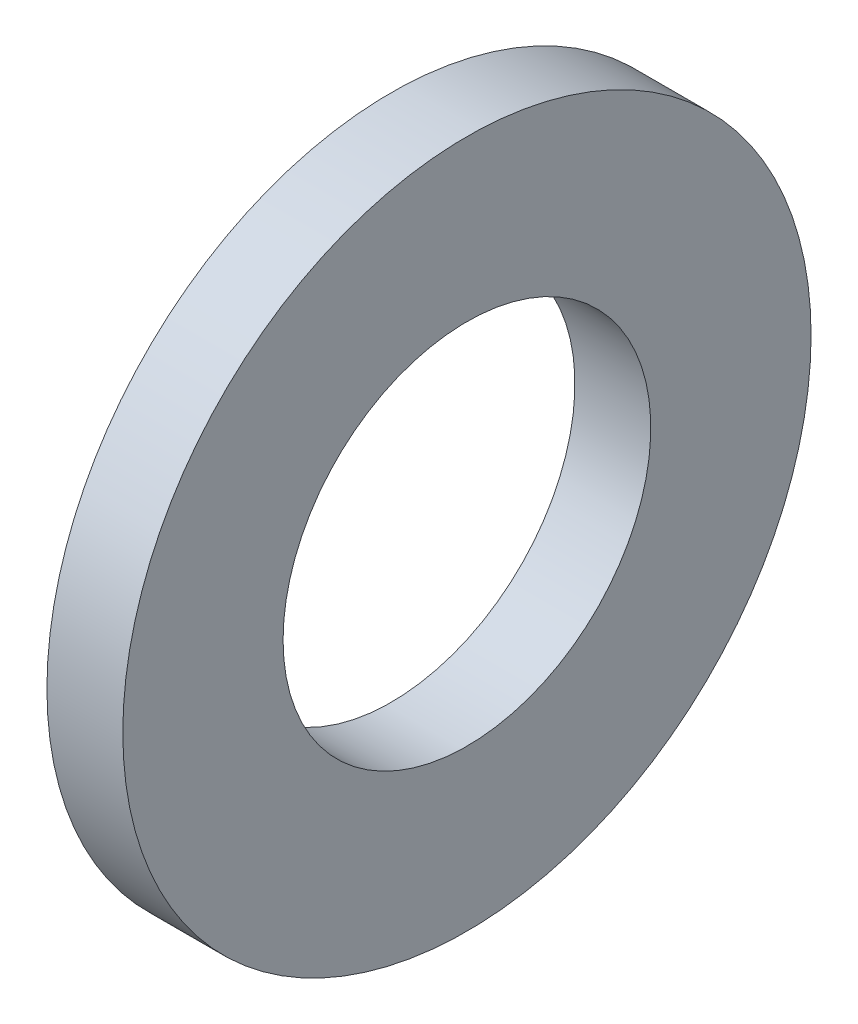
ISO-10303-21;
HEADER;
FILE_DESCRIPTION(('STEP AP214'),'2;1');
FILE_NAME('part.step','',(''),(''),'','','');
FILE_SCHEMA(('AUTOMOTIVE_DESIGN { 1 0 10303 214 1 1 1 1 }'));
ENDSEC;
DATA;
#1=APPLICATION_CONTEXT('core data for automotive mechanical design processes');
#2=APPLICATION_PROTOCOL_DEFINITION('international standard','automotive_design',2000,#1);
#3=PRODUCT_CONTEXT('',#1,'mechanical');
#4=PRODUCT('Part','Part','',(#3));
#5=PRODUCT_RELATED_PRODUCT_CATEGORY('part','',(#4));
#6=PRODUCT_DEFINITION_FORMATION('','',#4);
#7=PRODUCT_DEFINITION_CONTEXT('part definition',#1,'design');
#8=PRODUCT_DEFINITION('design','',#6,#7);
#9=PRODUCT_DEFINITION_SHAPE('','',#8);
#10=(LENGTH_UNIT() NAMED_UNIT(*) SI_UNIT(.MILLI.,.METRE.));
#11=(NAMED_UNIT(*) PLANE_ANGLE_UNIT() SI_UNIT($,.RADIAN.));
#12=(NAMED_UNIT(*) SI_UNIT($,.STERADIAN.) SOLID_ANGLE_UNIT());
#13=UNCERTAINTY_MEASURE_WITH_UNIT(LENGTH_MEASURE(1.E-05),#10,'distance_accuracy_value','');
#14=(GEOMETRIC_REPRESENTATION_CONTEXT(3) GLOBAL_UNCERTAINTY_ASSIGNED_CONTEXT((#13)) GLOBAL_UNIT_ASSIGNED_CONTEXT((#10,
#11,#12)) REPRESENTATION_CONTEXT('',''));
#15=CARTESIAN_POINT('',(0.,0.,0.));
#16=DIRECTION('',(0.,0.,1.));
#17=DIRECTION('',(1.,0.,0.));
#18=AXIS2_PLACEMENT_3D('',#15,#16,#17);
#19=CARTESIAN_POINT('',(-34.9249999999999,0.,0.));
#20=DIRECTION('',(-1.,0.,0.));
#21=DIRECTION('',(0.,0.,1.));
#22=AXIS2_PLACEMENT_3D('',#19,#20,#21);
#23=CYLINDRICAL_SURFACE('',#22,6.785);
#24=CARTESIAN_POINT('',(0.,0.,0.));
#25=DIRECTION('',(-1.,0.,0.));
#26=DIRECTION('',(0.,0.,1.));
#27=AXIS2_PLACEMENT_3D('',#24,#25,#26);
#28=CIRCLE('',#27,6.785);
#29=CARTESIAN_POINT('',(0.,0.,6.785));
#30=VERTEX_POINT('',#29);
#31=EDGE_CURVE('E10',#30,#30,#28,.T.);
#32=ORIENTED_EDGE('',*,*,#31,.F.);
#33=EDGE_LOOP('',(#32));
#34=FACE_BOUND('',#33,.T.);
#35=CARTESIAN_POINT('',(-2.8,0.,0.));
#36=DIRECTION('',(-1.,0.,0.));
#37=DIRECTION('',(0.,0.,1.));
#38=AXIS2_PLACEMENT_3D('',#35,#36,#37);
#39=CIRCLE('',#38,6.785);
#40=CARTESIAN_POINT('',(-2.8,0.,6.785));
#41=VERTEX_POINT('',#40);
#42=EDGE_CURVE('E45',#41,#41,#39,.T.);
#43=ORIENTED_EDGE('',*,*,#42,.T.);
#44=EDGE_LOOP('',(#43));
#45=FACE_BOUND('',#44,.T.);
#46=ADVANCED_FACE('F31',(#34,#45),#23,.F.);
#47=CARTESIAN_POINT('',(0.,6.785,0.));
#48=DIRECTION('',(-1.,0.,0.));
#49=DIRECTION('',(0.,0.,1.));
#50=AXIS2_PLACEMENT_3D('',#47,#48,#49);
#51=PLANE('',#50);
#52=CARTESIAN_POINT('',(0.,0.,0.));
#53=DIRECTION('',(-1.,0.,0.));
#54=DIRECTION('',(0.,0.,1.));
#55=AXIS2_PLACEMENT_3D('',#52,#53,#54);
#56=CIRCLE('',#55,12.7);
#57=CARTESIAN_POINT('',(0.,0.,12.7));
#58=VERTEX_POINT('',#57);
#59=EDGE_CURVE('E37',#58,#58,#56,.T.);
#60=ORIENTED_EDGE('',*,*,#59,.F.);
#61=EDGE_LOOP('',(#60));
#62=FACE_BOUND('',#61,.T.);
#63=ORIENTED_EDGE('',*,*,#31,.T.);
#64=EDGE_LOOP('',(#63));
#65=FACE_BOUND('',#64,.T.);
#66=ADVANCED_FACE('F60',(#62,#65),#51,.F.);
#67=CARTESIAN_POINT('',(-34.9249999999999,0.,0.));
#68=DIRECTION('',(-1.,0.,0.));
#69=DIRECTION('',(0.,0.,1.));
#70=AXIS2_PLACEMENT_3D('',#67,#68,#69);
#71=CYLINDRICAL_SURFACE('',#70,12.7);
#72=CARTESIAN_POINT('',(-2.8,0.,0.));
#73=DIRECTION('',(-1.,0.,0.));
#74=DIRECTION('',(0.,0.,1.));
#75=AXIS2_PLACEMENT_3D('',#72,#73,#74);
#76=CIRCLE('',#75,12.7);
#77=CARTESIAN_POINT('',(-2.8,0.,12.7));
#78=VERTEX_POINT('',#77);
#79=EDGE_CURVE('E41',#78,#78,#76,.T.);
#80=ORIENTED_EDGE('',*,*,#79,.F.);
#81=EDGE_LOOP('',(#80));
#82=FACE_BOUND('',#81,.T.);
#83=ORIENTED_EDGE('',*,*,#59,.T.);
#84=EDGE_LOOP('',(#83));
#85=FACE_BOUND('',#84,.T.);
#86=ADVANCED_FACE('F55',(#82,#85),#71,.T.);
#87=CARTESIAN_POINT('',(-2.8,12.7,0.));
#88=DIRECTION('',(1.,0.,0.));
#89=DIRECTION('',(0.,0.,-1.));
#90=AXIS2_PLACEMENT_3D('',#87,#88,#89);
#91=PLANE('',#90);
#92=ORIENTED_EDGE('',*,*,#42,.F.);
#93=EDGE_LOOP('',(#92));
#94=FACE_BOUND('',#93,.T.);
#95=ORIENTED_EDGE('',*,*,#79,.T.);
#96=EDGE_LOOP('',(#95));
#97=FACE_BOUND('',#96,.T.);
#98=ADVANCED_FACE('F52',(#94,#97),#91,.F.);
#99=CLOSED_SHELL('',(#46,#66,#86,#98));
#100=MANIFOLD_SOLID_BREP('B2',#99);
#101=ADVANCED_BREP_SHAPE_REPRESENTATION('',(#18,#100),#14);
#102=SHAPE_DEFINITION_REPRESENTATION(#9,#101);
ENDSEC;
END-ISO-10303-21;
